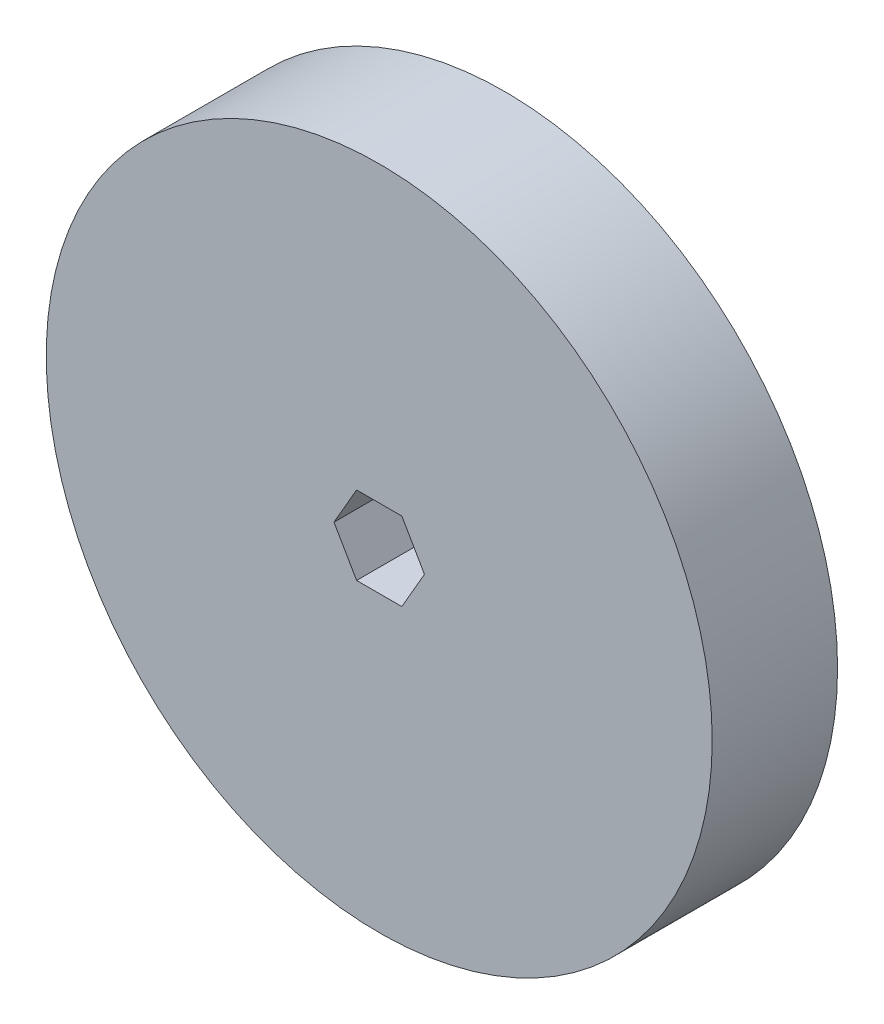
ISO-10303-21;
HEADER;
FILE_DESCRIPTION(('STEP AP214'),'2;1');
FILE_NAME('part.step','',(''),(''),'','','');
FILE_SCHEMA(('AUTOMOTIVE_DESIGN { 1 0 10303 214 1 1 1 1 }'));
ENDSEC;
DATA;
#1=APPLICATION_CONTEXT('core data for automotive mechanical design processes');
#2=APPLICATION_PROTOCOL_DEFINITION('international standard','automotive_design',2000,#1);
#3=PRODUCT_CONTEXT('',#1,'mechanical');
#4=PRODUCT('Part','Part','',(#3));
#5=PRODUCT_RELATED_PRODUCT_CATEGORY('part','',(#4));
#6=PRODUCT_DEFINITION_FORMATION('','',#4);
#7=PRODUCT_DEFINITION_CONTEXT('part definition',#1,'design');
#8=PRODUCT_DEFINITION('design','',#6,#7);
#9=PRODUCT_DEFINITION_SHAPE('','',#8);
#10=(LENGTH_UNIT() NAMED_UNIT(*) SI_UNIT(.MILLI.,.METRE.));
#11=(NAMED_UNIT(*) PLANE_ANGLE_UNIT() SI_UNIT($,.RADIAN.));
#12=(NAMED_UNIT(*) SI_UNIT($,.STERADIAN.) SOLID_ANGLE_UNIT());
#13=UNCERTAINTY_MEASURE_WITH_UNIT(LENGTH_MEASURE(1.E-05),#10,'distance_accuracy_value','');
#14=(GEOMETRIC_REPRESENTATION_CONTEXT(3) GLOBAL_UNCERTAINTY_ASSIGNED_CONTEXT((#13)) GLOBAL_UNIT_ASSIGNED_CONTEXT((#10,
#11,#12)) REPRESENTATION_CONTEXT('',''));
#15=CARTESIAN_POINT('',(0.,0.,0.));
#16=DIRECTION('',(0.,0.,1.));
#17=DIRECTION('',(1.,0.,0.));
#18=AXIS2_PLACEMENT_3D('',#15,#16,#17);
#19=CARTESIAN_POINT('',(0.,0.,8.));
#20=DIRECTION('',(0.,0.,1.));
#21=DIRECTION('',(1.,0.,0.));
#22=AXIS2_PLACEMENT_3D('',#19,#20,#21);
#23=PLANE('',#22);
#24=CARTESIAN_POINT('',(0.,0.,8.));
#25=DIRECTION('',(0.,0.,1.));
#26=DIRECTION('',(1.,0.,0.));
#27=AXIS2_PLACEMENT_3D('',#24,#25,#26);
#28=CIRCLE('',#27,21.25);
#29=CARTESIAN_POINT('',(21.25,0.,8.));
#30=VERTEX_POINT('',#29);
#31=EDGE_CURVE('E11',#30,#30,#28,.T.);
#32=ORIENTED_EDGE('',*,*,#31,.T.);
#33=EDGE_LOOP('',(#32));
#34=FACE_BOUND('',#33,.T.);
#35=DIRECTION('',(-0.5,0.866025403784439,0.));
#36=VECTOR('',#35,1.);
#37=CARTESIAN_POINT('',(2.88675134594813,0.,8.));
#38=LINE('',#37,#36);
#39=CARTESIAN_POINT('',(2.88675134594813,0.,8.));
#40=VERTEX_POINT('',#39);
#41=CARTESIAN_POINT('',(1.44337567297406,2.50000000000001,8.));
#42=VERTEX_POINT('',#41);
#43=EDGE_CURVE('E94',#40,#42,#38,.T.);
#44=ORIENTED_EDGE('',*,*,#43,.F.);
#45=DIRECTION('',(0.5,0.866025403784439,0.));
#46=VECTOR('',#45,1.);
#47=CARTESIAN_POINT('',(1.44337567297406,-2.5,8.));
#48=LINE('',#47,#46);
#49=CARTESIAN_POINT('',(1.44337567297406,-2.5,8.));
#50=VERTEX_POINT('',#49);
#51=EDGE_CURVE('E86',#50,#40,#48,.T.);
#52=ORIENTED_EDGE('',*,*,#51,.F.);
#53=DIRECTION('',(1.,0.,0.));
#54=VECTOR('',#53,1.);
#55=CARTESIAN_POINT('',(-1.44337567297407,-2.5,8.));
#56=LINE('',#55,#54);
#57=CARTESIAN_POINT('',(-1.44337567297407,-2.5,8.));
#58=VERTEX_POINT('',#57);
#59=EDGE_CURVE('E114',#58,#50,#56,.T.);
#60=ORIENTED_EDGE('',*,*,#59,.F.);
#61=DIRECTION('',(0.5,-0.866025403784439,0.));
#62=VECTOR('',#61,1.);
#63=CARTESIAN_POINT('',(-2.88675134594813,0.,8.));
#64=LINE('',#63,#62);
#65=CARTESIAN_POINT('',(-2.88675134594813,0.,8.));
#66=VERTEX_POINT('',#65);
#67=EDGE_CURVE('E112',#66,#58,#64,.T.);
#68=ORIENTED_EDGE('',*,*,#67,.F.);
#69=DIRECTION('',(-0.5,-0.866025403784439,0.));
#70=VECTOR('',#69,1.);
#71=CARTESIAN_POINT('',(-1.44337567297407,2.50000000000001,8.));
#72=LINE('',#71,#70);
#73=CARTESIAN_POINT('',(-1.44337567297407,2.50000000000001,8.));
#74=VERTEX_POINT('',#73);
#75=EDGE_CURVE('E108',#74,#66,#72,.T.);
#76=ORIENTED_EDGE('',*,*,#75,.F.);
#77=DIRECTION('',(-1.,0.,0.));
#78=VECTOR('',#77,1.);
#79=CARTESIAN_POINT('',(1.44337567297406,2.50000000000001,8.));
#80=LINE('',#79,#78);
#81=EDGE_CURVE('E106',#42,#74,#80,.T.);
#82=ORIENTED_EDGE('',*,*,#81,.F.);
#83=EDGE_LOOP('',(#44,#52,#60,#68,#76,#82));
#84=FACE_BOUND('',#83,.T.);
#85=ADVANCED_FACE('F33',(#34,#84),#23,.T.);
#86=CARTESIAN_POINT('',(0.,0.,0.));
#87=DIRECTION('',(0.,0.,1.));
#88=DIRECTION('',(1.,0.,0.));
#89=AXIS2_PLACEMENT_3D('',#86,#87,#88);
#90=PLANE('',#89);
#91=CARTESIAN_POINT('',(0.,0.,0.));
#92=DIRECTION('',(0.,0.,1.));
#93=DIRECTION('',(1.,0.,0.));
#94=AXIS2_PLACEMENT_3D('',#91,#92,#93);
#95=CIRCLE('',#94,21.25);
#96=CARTESIAN_POINT('',(21.25,0.,0.));
#97=VERTEX_POINT('',#96);
#98=EDGE_CURVE('E37',#97,#97,#95,.T.);
#99=ORIENTED_EDGE('',*,*,#98,.F.);
#100=EDGE_LOOP('',(#99));
#101=FACE_BOUND('',#100,.T.);
#102=DIRECTION('',(0.5,0.866025403784439,0.));
#103=VECTOR('',#102,1.);
#104=CARTESIAN_POINT('',(1.44337567297406,-2.5,0.));
#105=LINE('',#104,#103);
#106=CARTESIAN_POINT('',(1.44337567297406,-2.5,0.));
#107=VERTEX_POINT('',#106);
#108=CARTESIAN_POINT('',(2.88675134594813,0.,0.));
#109=VERTEX_POINT('',#108);
#110=EDGE_CURVE('E56',#107,#109,#105,.T.);
#111=ORIENTED_EDGE('',*,*,#110,.T.);
#112=DIRECTION('',(-0.5,0.866025403784439,0.));
#113=VECTOR('',#112,1.);
#114=CARTESIAN_POINT('',(2.88675134594813,0.,0.));
#115=LINE('',#114,#113);
#116=CARTESIAN_POINT('',(1.44337567297406,2.50000000000001,0.));
#117=VERTEX_POINT('',#116);
#118=EDGE_CURVE('E101',#109,#117,#115,.T.);
#119=ORIENTED_EDGE('',*,*,#118,.T.);
#120=DIRECTION('',(-1.,0.,0.));
#121=VECTOR('',#120,1.);
#122=CARTESIAN_POINT('',(1.44337567297406,2.50000000000001,0.));
#123=LINE('',#122,#121);
#124=CARTESIAN_POINT('',(-1.44337567297407,2.50000000000001,0.));
#125=VERTEX_POINT('',#124);
#126=EDGE_CURVE('E118',#117,#125,#123,.T.);
#127=ORIENTED_EDGE('',*,*,#126,.T.);
#128=DIRECTION('',(-0.5,-0.866025403784439,0.));
#129=VECTOR('',#128,1.);
#130=CARTESIAN_POINT('',(-1.44337567297407,2.50000000000001,0.));
#131=LINE('',#130,#129);
#132=CARTESIAN_POINT('',(-2.88675134594813,0.,0.));
#133=VERTEX_POINT('',#132);
#134=EDGE_CURVE('E121',#125,#133,#131,.T.);
#135=ORIENTED_EDGE('',*,*,#134,.T.);
#136=DIRECTION('',(0.5,-0.866025403784439,0.));
#137=VECTOR('',#136,1.);
#138=CARTESIAN_POINT('',(-2.88675134594813,0.,0.));
#139=LINE('',#138,#137);
#140=CARTESIAN_POINT('',(-1.44337567297407,-2.5,0.));
#141=VERTEX_POINT('',#140);
#142=EDGE_CURVE('E124',#133,#141,#139,.T.);
#143=ORIENTED_EDGE('',*,*,#142,.T.);
#144=DIRECTION('',(1.,0.,0.));
#145=VECTOR('',#144,1.);
#146=CARTESIAN_POINT('',(-1.44337567297407,-2.5,0.));
#147=LINE('',#146,#145);
#148=EDGE_CURVE('E95',#141,#107,#147,.T.);
#149=ORIENTED_EDGE('',*,*,#148,.T.);
#150=EDGE_LOOP('',(#111,#119,#127,#135,#143,#149));
#151=FACE_BOUND('',#150,.T.);
#152=ADVANCED_FACE('F141',(#101,#151),#90,.F.);
#153=CARTESIAN_POINT('',(0.,0.,8.));
#154=DIRECTION('',(0.,0.,-1.));
#155=DIRECTION('',(-1.,0.,0.));
#156=AXIS2_PLACEMENT_3D('',#153,#154,#155);
#157=CYLINDRICAL_SURFACE('',#156,21.25);
#158=ORIENTED_EDGE('',*,*,#31,.F.);
#159=EDGE_LOOP('',(#158));
#160=FACE_BOUND('',#159,.T.);
#161=ORIENTED_EDGE('',*,*,#98,.T.);
#162=EDGE_LOOP('',(#161));
#163=FACE_BOUND('',#162,.T.);
#164=ADVANCED_FACE('F35',(#160,#163),#157,.T.);
#165=CARTESIAN_POINT('',(1.44337567297406,-2.5,8.));
#166=DIRECTION('',(-0.866025403784439,0.5,0.));
#167=DIRECTION('',(-0.5,-0.866025403784439,0.));
#168=AXIS2_PLACEMENT_3D('',#165,#166,#167);
#169=PLANE('',#168);
#170=ORIENTED_EDGE('',*,*,#110,.F.);
#171=DIRECTION('',(0.,0.,-1.));
#172=VECTOR('',#171,1.);
#173=CARTESIAN_POINT('',(1.44337567297406,-2.5,8.));
#174=LINE('',#173,#172);
#175=EDGE_CURVE('E90',#50,#107,#174,.T.);
#176=ORIENTED_EDGE('',*,*,#175,.F.);
#177=ORIENTED_EDGE('',*,*,#51,.T.);
#178=DIRECTION('',(0.,0.,-1.));
#179=VECTOR('',#178,1.);
#180=CARTESIAN_POINT('',(2.88675134594813,0.,8.));
#181=LINE('',#180,#179);
#182=EDGE_CURVE('E89',#40,#109,#181,.T.);
#183=ORIENTED_EDGE('',*,*,#182,.T.);
#184=EDGE_LOOP('',(#170,#176,#177,#183));
#185=FACE_BOUND('',#184,.T.);
#186=ADVANCED_FACE('F88',(#185),#169,.T.);
#187=CARTESIAN_POINT('',(2.88675134594813,0.,8.));
#188=DIRECTION('',(-0.866025403784439,-0.5,0.));
#189=DIRECTION('',(0.5,-0.866025403784439,0.));
#190=AXIS2_PLACEMENT_3D('',#187,#188,#189);
#191=PLANE('',#190);
#192=ORIENTED_EDGE('',*,*,#118,.F.);
#193=ORIENTED_EDGE('',*,*,#182,.F.);
#194=ORIENTED_EDGE('',*,*,#43,.T.);
#195=DIRECTION('',(0.,0.,-1.));
#196=VECTOR('',#195,1.);
#197=CARTESIAN_POINT('',(1.44337567297406,2.50000000000001,8.));
#198=LINE('',#197,#196);
#199=EDGE_CURVE('E102',#42,#117,#198,.T.);
#200=ORIENTED_EDGE('',*,*,#199,.T.);
#201=EDGE_LOOP('',(#192,#193,#194,#200));
#202=FACE_BOUND('',#201,.T.);
#203=ADVANCED_FACE('F98',(#202),#191,.T.);
#204=CARTESIAN_POINT('',(1.44337567297406,2.50000000000001,8.));
#205=DIRECTION('',(0.,-1.,0.));
#206=DIRECTION('',(1.,0.,0.));
#207=AXIS2_PLACEMENT_3D('',#204,#205,#206);
#208=PLANE('',#207);
#209=ORIENTED_EDGE('',*,*,#126,.F.);
#210=ORIENTED_EDGE('',*,*,#199,.F.);
#211=ORIENTED_EDGE('',*,*,#81,.T.);
#212=DIRECTION('',(0.,0.,-1.));
#213=VECTOR('',#212,1.);
#214=CARTESIAN_POINT('',(-1.44337567297407,2.50000000000001,8.));
#215=LINE('',#214,#213);
#216=EDGE_CURVE('E133',#74,#125,#215,.T.);
#217=ORIENTED_EDGE('',*,*,#216,.T.);
#218=EDGE_LOOP('',(#209,#210,#211,#217));
#219=FACE_BOUND('',#218,.T.);
#220=ADVANCED_FACE('F137',(#219),#208,.T.);
#221=CARTESIAN_POINT('',(-1.44337567297407,2.50000000000001,8.));
#222=DIRECTION('',(0.866025403784439,-0.5,0.));
#223=DIRECTION('',(0.5,0.866025403784439,0.));
#224=AXIS2_PLACEMENT_3D('',#221,#222,#223);
#225=PLANE('',#224);
#226=ORIENTED_EDGE('',*,*,#134,.F.);
#227=ORIENTED_EDGE('',*,*,#216,.F.);
#228=ORIENTED_EDGE('',*,*,#75,.T.);
#229=DIRECTION('',(0.,0.,-1.));
#230=VECTOR('',#229,1.);
#231=CARTESIAN_POINT('',(-2.88675134594813,0.,8.));
#232=LINE('',#231,#230);
#233=EDGE_CURVE('E131',#66,#133,#232,.T.);
#234=ORIENTED_EDGE('',*,*,#233,.T.);
#235=EDGE_LOOP('',(#226,#227,#228,#234));
#236=FACE_BOUND('',#235,.T.);
#237=ADVANCED_FACE('F149',(#236),#225,.T.);
#238=CARTESIAN_POINT('',(-2.88675134594813,0.,8.));
#239=DIRECTION('',(0.866025403784439,0.5,0.));
#240=DIRECTION('',(-0.5,0.866025403784439,0.));
#241=AXIS2_PLACEMENT_3D('',#238,#239,#240);
#242=PLANE('',#241);
#243=ORIENTED_EDGE('',*,*,#142,.F.);
#244=ORIENTED_EDGE('',*,*,#233,.F.);
#245=ORIENTED_EDGE('',*,*,#67,.T.);
#246=DIRECTION('',(0.,0.,-1.));
#247=VECTOR('',#246,1.);
#248=CARTESIAN_POINT('',(-1.44337567297407,-2.5,8.));
#249=LINE('',#248,#247);
#250=EDGE_CURVE('E48',#58,#141,#249,.T.);
#251=ORIENTED_EDGE('',*,*,#250,.T.);
#252=EDGE_LOOP('',(#243,#244,#245,#251));
#253=FACE_BOUND('',#252,.T.);
#254=ADVANCED_FACE('F147',(#253),#242,.T.);
#255=CARTESIAN_POINT('',(-1.44337567297407,-2.5,8.));
#256=DIRECTION('',(0.,1.,0.));
#257=DIRECTION('',(0.,0.,1.));
#258=AXIS2_PLACEMENT_3D('',#255,#256,#257);
#259=PLANE('',#258);
#260=ORIENTED_EDGE('',*,*,#148,.F.);
#261=ORIENTED_EDGE('',*,*,#250,.F.);
#262=ORIENTED_EDGE('',*,*,#59,.T.);
#263=ORIENTED_EDGE('',*,*,#175,.T.);
#264=EDGE_LOOP('',(#260,#261,#262,#263));
#265=FACE_BOUND('',#264,.T.);
#266=ADVANCED_FACE('F143',(#265),#259,.T.);
#267=CLOSED_SHELL('',(#85,#152,#164,#186,#203,#220,#237,#254,#266));
#268=MANIFOLD_SOLID_BREP('B2',#267);
#269=ADVANCED_BREP_SHAPE_REPRESENTATION('',(#18,#268),#14);
#270=SHAPE_DEFINITION_REPRESENTATION(#9,#269);
ENDSEC;
END-ISO-10303-21;
